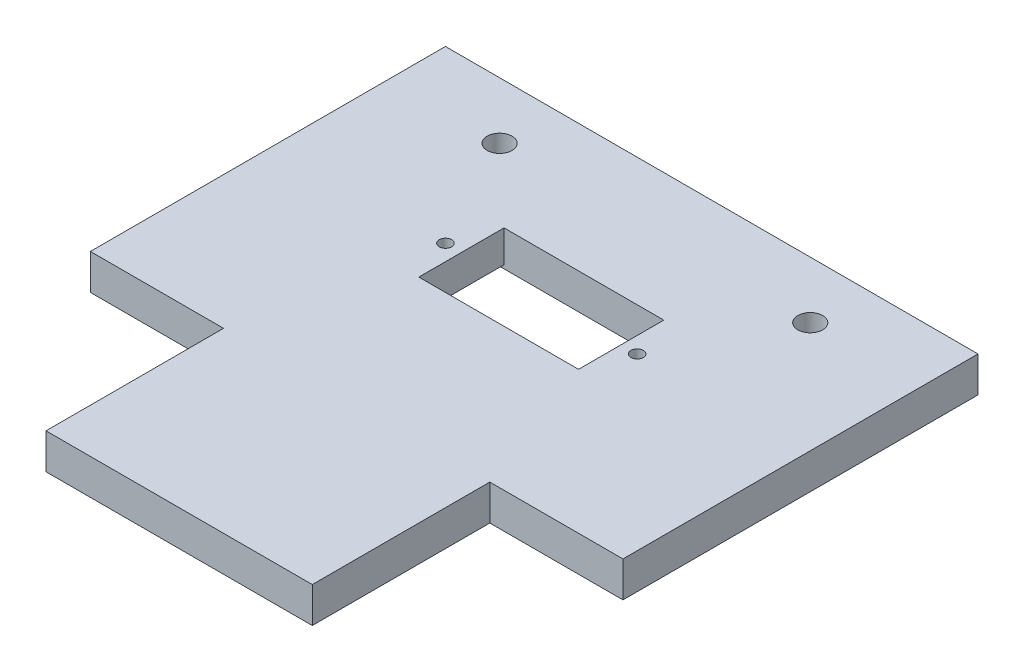
ISO-10303-21;
HEADER;
FILE_DESCRIPTION(('STEP AP214'),'2;1');
FILE_NAME('part.step','',(''),(''),'','','');
FILE_SCHEMA(('AUTOMOTIVE_DESIGN { 1 0 10303 214 1 1 1 1 }'));
ENDSEC;
DATA;
#1=APPLICATION_CONTEXT('core data for automotive mechanical design processes');
#2=APPLICATION_PROTOCOL_DEFINITION('international standard','automotive_design',2000,#1);
#3=PRODUCT_CONTEXT('',#1,'mechanical');
#4=PRODUCT('Part','Part','',(#3));
#5=PRODUCT_RELATED_PRODUCT_CATEGORY('part','',(#4));
#6=PRODUCT_DEFINITION_FORMATION('','',#4);
#7=PRODUCT_DEFINITION_CONTEXT('part definition',#1,'design');
#8=PRODUCT_DEFINITION('design','',#6,#7);
#9=PRODUCT_DEFINITION_SHAPE('','',#8);
#10=(LENGTH_UNIT() NAMED_UNIT(*) SI_UNIT(.MILLI.,.METRE.));
#11=(NAMED_UNIT(*) PLANE_ANGLE_UNIT() SI_UNIT($,.RADIAN.));
#12=(NAMED_UNIT(*) SI_UNIT($,.STERADIAN.) SOLID_ANGLE_UNIT());
#13=UNCERTAINTY_MEASURE_WITH_UNIT(LENGTH_MEASURE(1.E-05),#10,'distance_accuracy_value','');
#14=(GEOMETRIC_REPRESENTATION_CONTEXT(3) GLOBAL_UNCERTAINTY_ASSIGNED_CONTEXT((#13)) GLOBAL_UNIT_ASSIGNED_CONTEXT((#10,
#11,#12)) REPRESENTATION_CONTEXT('',''));
#15=CARTESIAN_POINT('',(0.,0.,0.));
#16=DIRECTION('',(0.,0.,1.));
#17=DIRECTION('',(1.,0.,0.));
#18=AXIS2_PLACEMENT_3D('',#15,#16,#17);
#19=CARTESIAN_POINT('',(38.1,5.08,-38.1));
#20=DIRECTION('',(-1.,0.,0.));
#21=DIRECTION('',(0.,0.,1.));
#22=AXIS2_PLACEMENT_3D('',#19,#20,#21);
#23=PLANE('',#22);
#24=DIRECTION('',(0.,0.,-1.));
#25=VECTOR('',#24,1.);
#26=CARTESIAN_POINT('',(38.1,0.,-38.1));
#27=LINE('',#26,#25);
#28=CARTESIAN_POINT('',(38.1,0.,12.7));
#29=VERTEX_POINT('',#28);
#30=CARTESIAN_POINT('',(38.1,0.,-38.1));
#31=VERTEX_POINT('',#30);
#32=EDGE_CURVE('E268',#29,#31,#27,.T.);
#33=ORIENTED_EDGE('',*,*,#32,.T.);
#34=DIRECTION('',(0.,-1.,0.));
#35=VECTOR('',#34,1.);
#36=CARTESIAN_POINT('',(38.1,5.08,-38.1));
#37=LINE('',#36,#35);
#38=CARTESIAN_POINT('',(38.1,5.08,-38.1));
#39=VERTEX_POINT('',#38);
#40=EDGE_CURVE('E11',#39,#31,#37,.T.);
#41=ORIENTED_EDGE('',*,*,#40,.F.);
#42=DIRECTION('',(0.,0.,-1.));
#43=VECTOR('',#42,1.);
#44=CARTESIAN_POINT('',(38.1,5.08,-38.1));
#45=LINE('',#44,#43);
#46=CARTESIAN_POINT('',(38.1,5.08,12.7));
#47=VERTEX_POINT('',#46);
#48=EDGE_CURVE('E271',#47,#39,#45,.T.);
#49=ORIENTED_EDGE('',*,*,#48,.F.);
#50=DIRECTION('',(0.,-1.,0.));
#51=VECTOR('',#50,1.);
#52=CARTESIAN_POINT('',(38.1,5.08,12.7));
#53=LINE('',#52,#51);
#54=EDGE_CURVE('E289',#47,#29,#53,.T.);
#55=ORIENTED_EDGE('',*,*,#54,.T.);
#56=EDGE_LOOP('',(#33,#41,#49,#55));
#57=FACE_BOUND('',#56,.T.);
#58=ADVANCED_FACE('F35',(#57),#23,.F.);
#59=CARTESIAN_POINT('',(-38.1,5.08,-38.1));
#60=DIRECTION('',(0.,0.,1.));
#61=DIRECTION('',(1.,0.,0.));
#62=AXIS2_PLACEMENT_3D('',#59,#60,#61);
#63=PLANE('',#62);
#64=DIRECTION('',(-1.,0.,0.));
#65=VECTOR('',#64,1.);
#66=CARTESIAN_POINT('',(-38.1,0.,-38.1));
#67=LINE('',#66,#65);
#68=CARTESIAN_POINT('',(-38.1,0.,-38.1));
#69=VERTEX_POINT('',#68);
#70=EDGE_CURVE('E292',#31,#69,#67,.T.);
#71=ORIENTED_EDGE('',*,*,#70,.T.);
#72=DIRECTION('',(0.,-1.,0.));
#73=VECTOR('',#72,1.);
#74=CARTESIAN_POINT('',(-38.1,5.08,-38.1));
#75=LINE('',#74,#73);
#76=CARTESIAN_POINT('',(-38.1,5.08,-38.1));
#77=VERTEX_POINT('',#76);
#78=EDGE_CURVE('E43',#77,#69,#75,.T.);
#79=ORIENTED_EDGE('',*,*,#78,.F.);
#80=DIRECTION('',(-1.,0.,0.));
#81=VECTOR('',#80,1.);
#82=CARTESIAN_POINT('',(-38.1,5.08,-38.1));
#83=LINE('',#82,#81);
#84=EDGE_CURVE('E274',#39,#77,#83,.T.);
#85=ORIENTED_EDGE('',*,*,#84,.F.);
#86=ORIENTED_EDGE('',*,*,#40,.T.);
#87=EDGE_LOOP('',(#71,#79,#85,#86));
#88=FACE_BOUND('',#87,.T.);
#89=ADVANCED_FACE('F349',(#88),#63,.F.);
#90=CARTESIAN_POINT('',(-38.1,5.08,12.7));
#91=DIRECTION('',(1.,0.,0.));
#92=DIRECTION('',(0.,0.,-1.));
#93=AXIS2_PLACEMENT_3D('',#90,#91,#92);
#94=PLANE('',#93);
#95=DIRECTION('',(0.,0.,1.));
#96=VECTOR('',#95,1.);
#97=CARTESIAN_POINT('',(-38.1,0.,12.7));
#98=LINE('',#97,#96);
#99=CARTESIAN_POINT('',(-38.1,0.,12.7));
#100=VERTEX_POINT('',#99);
#101=EDGE_CURVE('E294',#69,#100,#98,.T.);
#102=ORIENTED_EDGE('',*,*,#101,.T.);
#103=DIRECTION('',(0.,-1.,0.));
#104=VECTOR('',#103,1.);
#105=CARTESIAN_POINT('',(-38.1,5.08,12.7));
#106=LINE('',#105,#104);
#107=CARTESIAN_POINT('',(-38.1,5.08,12.7));
#108=VERTEX_POINT('',#107);
#109=EDGE_CURVE('E319',#108,#100,#106,.T.);
#110=ORIENTED_EDGE('',*,*,#109,.F.);
#111=DIRECTION('',(0.,0.,1.));
#112=VECTOR('',#111,1.);
#113=CARTESIAN_POINT('',(-38.1,5.08,12.7));
#114=LINE('',#113,#112);
#115=EDGE_CURVE('E277',#77,#108,#114,.T.);
#116=ORIENTED_EDGE('',*,*,#115,.F.);
#117=ORIENTED_EDGE('',*,*,#78,.T.);
#118=EDGE_LOOP('',(#102,#110,#116,#117));
#119=FACE_BOUND('',#118,.T.);
#120=ADVANCED_FACE('F327',(#119),#94,.F.);
#121=CARTESIAN_POINT('',(-38.1,5.08,12.7));
#122=DIRECTION('',(0.,0.,-1.));
#123=DIRECTION('',(-1.,0.,0.));
#124=AXIS2_PLACEMENT_3D('',#121,#122,#123);
#125=PLANE('',#124);
#126=DIRECTION('',(1.,0.,0.));
#127=VECTOR('',#126,1.);
#128=CARTESIAN_POINT('',(-38.1,0.,12.7));
#129=LINE('',#128,#127);
#130=CARTESIAN_POINT('',(-19.05,0.,12.7));
#131=VERTEX_POINT('',#130);
#132=EDGE_CURVE('E296',#100,#131,#129,.T.);
#133=ORIENTED_EDGE('',*,*,#132,.T.);
#134=DIRECTION('',(0.,-1.,0.));
#135=VECTOR('',#134,1.);
#136=CARTESIAN_POINT('',(-19.05,5.08,12.7));
#137=LINE('',#136,#135);
#138=CARTESIAN_POINT('',(-19.05,5.08,12.7));
#139=VERTEX_POINT('',#138);
#140=EDGE_CURVE('E316',#139,#131,#137,.T.);
#141=ORIENTED_EDGE('',*,*,#140,.F.);
#142=DIRECTION('',(1.,0.,0.));
#143=VECTOR('',#142,1.);
#144=CARTESIAN_POINT('',(-38.1,5.08,12.7));
#145=LINE('',#144,#143);
#146=EDGE_CURVE('E279',#108,#139,#145,.T.);
#147=ORIENTED_EDGE('',*,*,#146,.F.);
#148=ORIENTED_EDGE('',*,*,#109,.T.);
#149=EDGE_LOOP('',(#133,#141,#147,#148));
#150=FACE_BOUND('',#149,.T.);
#151=ADVANCED_FACE('F337',(#150),#125,.F.);
#152=CARTESIAN_POINT('',(-19.05,5.08,38.1));
#153=DIRECTION('',(1.,0.,0.));
#154=DIRECTION('',(0.,0.,-1.));
#155=AXIS2_PLACEMENT_3D('',#152,#153,#154);
#156=PLANE('',#155);
#157=DIRECTION('',(0.,0.,1.));
#158=VECTOR('',#157,1.);
#159=CARTESIAN_POINT('',(-19.05,0.,38.1));
#160=LINE('',#159,#158);
#161=CARTESIAN_POINT('',(-19.05,0.,38.1));
#162=VERTEX_POINT('',#161);
#163=EDGE_CURVE('E298',#131,#162,#160,.T.);
#164=ORIENTED_EDGE('',*,*,#163,.T.);
#165=DIRECTION('',(0.,-1.,0.));
#166=VECTOR('',#165,1.);
#167=CARTESIAN_POINT('',(-19.05,5.08,38.1));
#168=LINE('',#167,#166);
#169=CARTESIAN_POINT('',(-19.05,5.08,38.1));
#170=VERTEX_POINT('',#169);
#171=EDGE_CURVE('E313',#170,#162,#168,.T.);
#172=ORIENTED_EDGE('',*,*,#171,.F.);
#173=DIRECTION('',(0.,0.,1.));
#174=VECTOR('',#173,1.);
#175=CARTESIAN_POINT('',(-19.05,5.08,38.1));
#176=LINE('',#175,#174);
#177=EDGE_CURVE('E281',#139,#170,#176,.T.);
#178=ORIENTED_EDGE('',*,*,#177,.F.);
#179=ORIENTED_EDGE('',*,*,#140,.T.);
#180=EDGE_LOOP('',(#164,#172,#178,#179));
#181=FACE_BOUND('',#180,.T.);
#182=ADVANCED_FACE('F341',(#181),#156,.F.);
#183=CARTESIAN_POINT('',(-19.05,5.08,38.1));
#184=DIRECTION('',(0.,0.,-1.));
#185=DIRECTION('',(-1.,0.,0.));
#186=AXIS2_PLACEMENT_3D('',#183,#184,#185);
#187=PLANE('',#186);
#188=DIRECTION('',(1.,0.,0.));
#189=VECTOR('',#188,1.);
#190=CARTESIAN_POINT('',(-19.05,0.,38.1));
#191=LINE('',#190,#189);
#192=CARTESIAN_POINT('',(19.05,0.,38.1));
#193=VERTEX_POINT('',#192);
#194=EDGE_CURVE('E300',#162,#193,#191,.T.);
#195=ORIENTED_EDGE('',*,*,#194,.T.);
#196=DIRECTION('',(0.,-1.,0.));
#197=VECTOR('',#196,1.);
#198=CARTESIAN_POINT('',(19.05,5.08,38.1));
#199=LINE('',#198,#197);
#200=CARTESIAN_POINT('',(19.05,5.08,38.1));
#201=VERTEX_POINT('',#200);
#202=EDGE_CURVE('E310',#201,#193,#199,.T.);
#203=ORIENTED_EDGE('',*,*,#202,.F.);
#204=DIRECTION('',(1.,0.,0.));
#205=VECTOR('',#204,1.);
#206=CARTESIAN_POINT('',(-19.05,5.08,38.1));
#207=LINE('',#206,#205);
#208=EDGE_CURVE('E283',#170,#201,#207,.T.);
#209=ORIENTED_EDGE('',*,*,#208,.F.);
#210=ORIENTED_EDGE('',*,*,#171,.T.);
#211=EDGE_LOOP('',(#195,#203,#209,#210));
#212=FACE_BOUND('',#211,.T.);
#213=ADVANCED_FACE('F362',(#212),#187,.F.);
#214=CARTESIAN_POINT('',(19.05,5.08,38.1));
#215=DIRECTION('',(-1.,0.,0.));
#216=DIRECTION('',(0.,0.,1.));
#217=AXIS2_PLACEMENT_3D('',#214,#215,#216);
#218=PLANE('',#217);
#219=DIRECTION('',(0.,0.,-1.));
#220=VECTOR('',#219,1.);
#221=CARTESIAN_POINT('',(19.05,0.,38.1));
#222=LINE('',#221,#220);
#223=CARTESIAN_POINT('',(19.05,0.,12.7));
#224=VERTEX_POINT('',#223);
#225=EDGE_CURVE('E302',#193,#224,#222,.T.);
#226=ORIENTED_EDGE('',*,*,#225,.T.);
#227=DIRECTION('',(0.,-1.,0.));
#228=VECTOR('',#227,1.);
#229=CARTESIAN_POINT('',(19.05,5.08,12.7));
#230=LINE('',#229,#228);
#231=CARTESIAN_POINT('',(19.05,5.08,12.7));
#232=VERTEX_POINT('',#231);
#233=EDGE_CURVE('E307',#232,#224,#230,.T.);
#234=ORIENTED_EDGE('',*,*,#233,.F.);
#235=DIRECTION('',(0.,0.,-1.));
#236=VECTOR('',#235,1.);
#237=CARTESIAN_POINT('',(19.05,5.08,38.1));
#238=LINE('',#237,#236);
#239=EDGE_CURVE('E285',#201,#232,#238,.T.);
#240=ORIENTED_EDGE('',*,*,#239,.F.);
#241=ORIENTED_EDGE('',*,*,#202,.T.);
#242=EDGE_LOOP('',(#226,#234,#240,#241));
#243=FACE_BOUND('',#242,.T.);
#244=ADVANCED_FACE('F360',(#243),#218,.F.);
#245=CARTESIAN_POINT('',(38.1,5.08,12.7));
#246=DIRECTION('',(0.,0.,-1.));
#247=DIRECTION('',(-1.,0.,0.));
#248=AXIS2_PLACEMENT_3D('',#245,#246,#247);
#249=PLANE('',#248);
#250=DIRECTION('',(1.,0.,0.));
#251=VECTOR('',#250,1.);
#252=CARTESIAN_POINT('',(38.1,0.,12.7));
#253=LINE('',#252,#251);
#254=EDGE_CURVE('E275',#224,#29,#253,.T.);
#255=ORIENTED_EDGE('',*,*,#254,.T.);
#256=ORIENTED_EDGE('',*,*,#54,.F.);
#257=DIRECTION('',(1.,0.,0.));
#258=VECTOR('',#257,1.);
#259=CARTESIAN_POINT('',(38.1,5.08,12.7));
#260=LINE('',#259,#258);
#261=EDGE_CURVE('E287',#232,#47,#260,.T.);
#262=ORIENTED_EDGE('',*,*,#261,.F.);
#263=ORIENTED_EDGE('',*,*,#233,.T.);
#264=EDGE_LOOP('',(#255,#256,#262,#263));
#265=FACE_BOUND('',#264,.T.);
#266=ADVANCED_FACE('F355',(#265),#249,.F.);
#267=CARTESIAN_POINT('',(0.,5.08,0.));
#268=DIRECTION('',(0.,-1.,0.));
#269=DIRECTION('',(0.,0.,-1.));
#270=AXIS2_PLACEMENT_3D('',#267,#268,#269);
#271=PLANE('',#270);
#272=CARTESIAN_POINT('',(13.716,5.08,-13.716));
#273=DIRECTION('',(0.,-1.,0.));
#274=DIRECTION('',(0.,0.,-1.));
#275=AXIS2_PLACEMENT_3D('',#272,#273,#274);
#276=CIRCLE('',#275,0.889);
#277=CARTESIAN_POINT('',(13.716,5.08,-14.605));
#278=VERTEX_POINT('',#277);
#279=EDGE_CURVE('E209',#278,#278,#276,.T.);
#280=ORIENTED_EDGE('',*,*,#279,.T.);
#281=EDGE_LOOP('',(#280));
#282=FACE_BOUND('',#281,.T.);
#283=CARTESIAN_POINT('',(-13.716,5.08,-13.716));
#284=DIRECTION('',(0.,-1.,0.));
#285=DIRECTION('',(0.,0.,-1.));
#286=AXIS2_PLACEMENT_3D('',#283,#284,#285);
#287=CIRCLE('',#286,0.889);
#288=CARTESIAN_POINT('',(-13.716,5.08,-14.605));
#289=VERTEX_POINT('',#288);
#290=EDGE_CURVE('E203',#289,#289,#287,.T.);
#291=ORIENTED_EDGE('',*,*,#290,.T.);
#292=EDGE_LOOP('',(#291));
#293=FACE_BOUND('',#292,.T.);
#294=DIRECTION('',(-1.,0.,0.));
#295=VECTOR('',#294,1.);
#296=CARTESIAN_POINT('',(-11.43,5.08,-19.812));
#297=LINE('',#296,#295);
#298=CARTESIAN_POINT('',(11.43,5.08,-19.812));
#299=VERTEX_POINT('',#298);
#300=CARTESIAN_POINT('',(-11.43,5.08,-19.812));
#301=VERTEX_POINT('',#300);
#302=EDGE_CURVE('E549',#299,#301,#297,.T.);
#303=ORIENTED_EDGE('',*,*,#302,.F.);
#304=DIRECTION('',(0.,0.,-1.));
#305=VECTOR('',#304,1.);
#306=CARTESIAN_POINT('',(11.43,5.08,-7.62));
#307=LINE('',#306,#305);
#308=CARTESIAN_POINT('',(11.43,5.08,-7.62));
#309=VERTEX_POINT('',#308);
#310=EDGE_CURVE('E59',#309,#299,#307,.T.);
#311=ORIENTED_EDGE('',*,*,#310,.F.);
#312=DIRECTION('',(1.,0.,0.));
#313=VECTOR('',#312,1.);
#314=CARTESIAN_POINT('',(-11.43,5.08,-7.62));
#315=LINE('',#314,#313);
#316=CARTESIAN_POINT('',(-11.43,5.08,-7.62));
#317=VERTEX_POINT('',#316);
#318=EDGE_CURVE('E230',#317,#309,#315,.T.);
#319=ORIENTED_EDGE('',*,*,#318,.F.);
#320=DIRECTION('',(0.,0.,1.));
#321=VECTOR('',#320,1.);
#322=CARTESIAN_POINT('',(-11.43,5.08,-7.62));
#323=LINE('',#322,#321);
#324=EDGE_CURVE('E546',#301,#317,#323,.T.);
#325=ORIENTED_EDGE('',*,*,#324,.F.);
#326=EDGE_LOOP('',(#303,#311,#319,#325));
#327=FACE_BOUND('',#326,.T.);
#328=CARTESIAN_POINT('',(22.225,5.08,-29.972));
#329=DIRECTION('',(0.,1.,0.));
#330=DIRECTION('',(0.,0.,-1.));
#331=AXIS2_PLACEMENT_3D('',#328,#329,#330);
#332=CIRCLE('',#331,1.778);
#333=CARTESIAN_POINT('',(22.225,5.08,-31.75));
#334=VERTEX_POINT('',#333);
#335=EDGE_CURVE('E253',#334,#334,#332,.T.);
#336=ORIENTED_EDGE('',*,*,#335,.F.);
#337=EDGE_LOOP('',(#336));
#338=FACE_BOUND('',#337,.T.);
#339=CARTESIAN_POINT('',(-22.225,5.08,-29.972));
#340=DIRECTION('',(0.,1.,0.));
#341=DIRECTION('',(0.,0.,1.));
#342=AXIS2_PLACEMENT_3D('',#339,#340,#341);
#343=CIRCLE('',#342,1.778);
#344=CARTESIAN_POINT('',(-22.225,5.08,-28.194));
#345=VERTEX_POINT('',#344);
#346=EDGE_CURVE('E261',#345,#345,#343,.T.);
#347=ORIENTED_EDGE('',*,*,#346,.F.);
#348=EDGE_LOOP('',(#347));
#349=FACE_BOUND('',#348,.T.);
#350=ORIENTED_EDGE('',*,*,#48,.T.);
#351=ORIENTED_EDGE('',*,*,#84,.T.);
#352=ORIENTED_EDGE('',*,*,#115,.T.);
#353=ORIENTED_EDGE('',*,*,#146,.T.);
#354=ORIENTED_EDGE('',*,*,#177,.T.);
#355=ORIENTED_EDGE('',*,*,#208,.T.);
#356=ORIENTED_EDGE('',*,*,#239,.T.);
#357=ORIENTED_EDGE('',*,*,#261,.T.);
#358=EDGE_LOOP('',(#350,#351,#352,#353,#354,#355,#356,#357));
#359=FACE_BOUND('',#358,.T.);
#360=ADVANCED_FACE('F345',(#282,#293,#327,#338,#349,#359),#271,.F.);
#361=CARTESIAN_POINT('',(0.,0.,0.));
#362=DIRECTION('',(0.,-1.,0.));
#363=DIRECTION('',(0.,0.,-1.));
#364=AXIS2_PLACEMENT_3D('',#361,#362,#363);
#365=PLANE('',#364);
#366=DIRECTION('',(0.,0.,-1.));
#367=VECTOR('',#366,1.);
#368=CARTESIAN_POINT('',(-16.51,0.,-7.61999999999998));
#369=LINE('',#368,#367);
#370=CARTESIAN_POINT('',(-16.51,0.,-7.61999999999998));
#371=VERTEX_POINT('',#370);
#372=CARTESIAN_POINT('',(-16.51,0.,-19.812));
#373=VERTEX_POINT('',#372);
#374=EDGE_CURVE('E51',#371,#373,#369,.T.);
#375=ORIENTED_EDGE('',*,*,#374,.F.);
#376=DIRECTION('',(-1.,0.,0.));
#377=VECTOR('',#376,1.);
#378=CARTESIAN_POINT('',(16.51,0.,-7.61999999999998));
#379=LINE('',#378,#377);
#380=CARTESIAN_POINT('',(16.51,0.,-7.61999999999998));
#381=VERTEX_POINT('',#380);
#382=EDGE_CURVE('E175',#381,#371,#379,.T.);
#383=ORIENTED_EDGE('',*,*,#382,.F.);
#384=DIRECTION('',(0.,0.,1.));
#385=VECTOR('',#384,1.);
#386=CARTESIAN_POINT('',(16.51,0.,-7.61999999999998));
#387=LINE('',#386,#385);
#388=CARTESIAN_POINT('',(16.51,0.,-19.812));
#389=VERTEX_POINT('',#388);
#390=EDGE_CURVE('E156',#389,#381,#387,.T.);
#391=ORIENTED_EDGE('',*,*,#390,.F.);
#392=DIRECTION('',(1.,0.,0.));
#393=VECTOR('',#392,1.);
#394=CARTESIAN_POINT('',(16.51,0.,-19.812));
#395=LINE('',#394,#393);
#396=EDGE_CURVE('E167',#373,#389,#395,.T.);
#397=ORIENTED_EDGE('',*,*,#396,.F.);
#398=EDGE_LOOP('',(#375,#383,#391,#397));
#399=FACE_BOUND('',#398,.T.);
#400=CARTESIAN_POINT('',(22.225,0.,-29.972));
#401=DIRECTION('',(0.,1.,0.));
#402=DIRECTION('',(0.,0.,-1.));
#403=AXIS2_PLACEMENT_3D('',#400,#401,#402);
#404=CIRCLE('',#403,1.778);
#405=CARTESIAN_POINT('',(22.225,0.,-31.75));
#406=VERTEX_POINT('',#405);
#407=EDGE_CURVE('E256',#406,#406,#404,.T.);
#408=ORIENTED_EDGE('',*,*,#407,.T.);
#409=EDGE_LOOP('',(#408));
#410=FACE_BOUND('',#409,.T.);
#411=CARTESIAN_POINT('',(-22.225,0.,-29.972));
#412=DIRECTION('',(0.,1.,0.));
#413=DIRECTION('',(0.,0.,1.));
#414=AXIS2_PLACEMENT_3D('',#411,#412,#413);
#415=CIRCLE('',#414,1.778);
#416=CARTESIAN_POINT('',(-22.225,0.,-28.194));
#417=VERTEX_POINT('',#416);
#418=EDGE_CURVE('E265',#417,#417,#415,.T.);
#419=ORIENTED_EDGE('',*,*,#418,.T.);
#420=EDGE_LOOP('',(#419));
#421=FACE_BOUND('',#420,.T.);
#422=ORIENTED_EDGE('',*,*,#32,.F.);
#423=ORIENTED_EDGE('',*,*,#254,.F.);
#424=ORIENTED_EDGE('',*,*,#225,.F.);
#425=ORIENTED_EDGE('',*,*,#194,.F.);
#426=ORIENTED_EDGE('',*,*,#163,.F.);
#427=ORIENTED_EDGE('',*,*,#132,.F.);
#428=ORIENTED_EDGE('',*,*,#101,.F.);
#429=ORIENTED_EDGE('',*,*,#70,.F.);
#430=EDGE_LOOP('',(#422,#423,#424,#425,#426,#427,#428,#429));
#431=FACE_BOUND('',#430,.T.);
#432=ADVANCED_FACE('F172',(#399,#410,#421,#431),#365,.T.);
#433=CARTESIAN_POINT('',(-22.225,0.,-29.972));
#434=DIRECTION('',(0.,1.,0.));
#435=DIRECTION('',(0.,0.,1.));
#436=AXIS2_PLACEMENT_3D('',#433,#434,#435);
#437=CYLINDRICAL_SURFACE('',#436,1.778);
#438=ORIENTED_EDGE('',*,*,#418,.F.);
#439=EDGE_LOOP('',(#438));
#440=FACE_BOUND('',#439,.T.);
#441=ORIENTED_EDGE('',*,*,#346,.T.);
#442=EDGE_LOOP('',(#441));
#443=FACE_BOUND('',#442,.T.);
#444=ADVANCED_FACE('F414',(#440,#443),#437,.F.);
#445=CARTESIAN_POINT('',(22.225,0.,-29.972));
#446=DIRECTION('',(0.,1.,0.));
#447=DIRECTION('',(0.,0.,1.));
#448=AXIS2_PLACEMENT_3D('',#445,#446,#447);
#449=CYLINDRICAL_SURFACE('',#448,1.778);
#450=ORIENTED_EDGE('',*,*,#407,.F.);
#451=EDGE_LOOP('',(#450));
#452=FACE_BOUND('',#451,.T.);
#453=ORIENTED_EDGE('',*,*,#335,.T.);
#454=EDGE_LOOP('',(#453));
#455=FACE_BOUND('',#454,.T.);
#456=ADVANCED_FACE('F419',(#452,#455),#449,.F.);
#457=CARTESIAN_POINT('',(11.43,0.508000000000001,-7.62));
#458=DIRECTION('',(1.,0.,0.));
#459=DIRECTION('',(0.,0.,-1.));
#460=AXIS2_PLACEMENT_3D('',#457,#458,#459);
#461=PLANE('',#460);
#462=ORIENTED_EDGE('',*,*,#310,.T.);
#463=DIRECTION('',(0.,1.,0.));
#464=VECTOR('',#463,1.);
#465=CARTESIAN_POINT('',(11.43,0.508000000000001,-19.812));
#466=LINE('',#465,#464);
#467=CARTESIAN_POINT('',(11.43,0.508000000000002,-19.812));
#468=VERTEX_POINT('',#467);
#469=EDGE_CURVE('E232',#468,#299,#466,.T.);
#470=ORIENTED_EDGE('',*,*,#469,.F.);
#471=DIRECTION('',(0.,0.,-1.));
#472=VECTOR('',#471,1.);
#473=CARTESIAN_POINT('',(11.43,0.508000000000001,-7.62));
#474=LINE('',#473,#472);
#475=CARTESIAN_POINT('',(11.43,0.508000000000002,-7.61999999999998));
#476=VERTEX_POINT('',#475);
#477=EDGE_CURVE('E227',#476,#468,#474,.T.);
#478=ORIENTED_EDGE('',*,*,#477,.F.);
#479=DIRECTION('',(0.,1.,0.));
#480=VECTOR('',#479,1.);
#481=CARTESIAN_POINT('',(11.43,0.508000000000001,-7.62));
#482=LINE('',#481,#480);
#483=EDGE_CURVE('E251',#476,#309,#482,.T.);
#484=ORIENTED_EDGE('',*,*,#483,.T.);
#485=EDGE_LOOP('',(#462,#470,#478,#484));
#486=FACE_BOUND('',#485,.T.);
#487=ADVANCED_FACE('F234',(#486),#461,.F.);
#488=CARTESIAN_POINT('',(-11.43,0.508000000000001,-7.62));
#489=DIRECTION('',(0.,0.,1.));
#490=DIRECTION('',(1.,0.,0.));
#491=AXIS2_PLACEMENT_3D('',#488,#489,#490);
#492=PLANE('',#491);
#493=ORIENTED_EDGE('',*,*,#318,.T.);
#494=ORIENTED_EDGE('',*,*,#483,.F.);
#495=DIRECTION('',(1.,0.,0.));
#496=VECTOR('',#495,1.);
#497=CARTESIAN_POINT('',(16.51,0.508000000000002,-7.61999999999998));
#498=LINE('',#497,#496);
#499=CARTESIAN_POINT('',(16.51,0.508000000000002,-7.61999999999998));
#500=VERTEX_POINT('',#499);
#501=EDGE_CURVE('E196',#476,#500,#498,.T.);
#502=ORIENTED_EDGE('',*,*,#501,.T.);
#503=DIRECTION('',(0.,-1.,0.));
#504=VECTOR('',#503,1.);
#505=CARTESIAN_POINT('',(16.51,35.7069383930823,-7.61999999999998));
#506=LINE('',#505,#504);
#507=EDGE_CURVE('E163',#500,#381,#506,.T.);
#508=ORIENTED_EDGE('',*,*,#507,.T.);
#509=ORIENTED_EDGE('',*,*,#382,.T.);
#510=DIRECTION('',(0.,-1.,0.));
#511=VECTOR('',#510,1.);
#512=CARTESIAN_POINT('',(-16.51,35.7069383930823,-7.61999999999998));
#513=LINE('',#512,#511);
#514=CARTESIAN_POINT('',(-16.51,0.508000000000002,-7.61999999999998));
#515=VERTEX_POINT('',#514);
#516=EDGE_CURVE('E180',#515,#371,#513,.T.);
#517=ORIENTED_EDGE('',*,*,#516,.F.);
#518=CARTESIAN_POINT('',(-11.43,0.508000000000002,-7.61999999999998));
#519=VERTEX_POINT('',#518);
#520=EDGE_CURVE('E192',#515,#519,#498,.T.);
#521=ORIENTED_EDGE('',*,*,#520,.T.);
#522=DIRECTION('',(0.,1.,0.));
#523=VECTOR('',#522,1.);
#524=CARTESIAN_POINT('',(-11.43,0.508000000000001,-7.62));
#525=LINE('',#524,#523);
#526=EDGE_CURVE('E236',#519,#317,#525,.T.);
#527=ORIENTED_EDGE('',*,*,#526,.T.);
#528=EDGE_LOOP('',(#493,#494,#502,#508,#509,#517,#521,#527));
#529=FACE_BOUND('',#528,.T.);
#530=ADVANCED_FACE('F446',(#529),#492,.F.);
#531=CARTESIAN_POINT('',(-11.43,0.508000000000001,-7.62));
#532=DIRECTION('',(-1.,0.,0.));
#533=DIRECTION('',(0.,0.,1.));
#534=AXIS2_PLACEMENT_3D('',#531,#532,#533);
#535=PLANE('',#534);
#536=ORIENTED_EDGE('',*,*,#324,.T.);
#537=ORIENTED_EDGE('',*,*,#526,.F.);
#538=DIRECTION('',(0.,0.,1.));
#539=VECTOR('',#538,1.);
#540=CARTESIAN_POINT('',(-11.43,0.508000000000001,-7.62));
#541=LINE('',#540,#539);
#542=CARTESIAN_POINT('',(-11.43,0.508000000000001,-19.812));
#543=VERTEX_POINT('',#542);
#544=EDGE_CURVE('E229',#543,#519,#541,.T.);
#545=ORIENTED_EDGE('',*,*,#544,.F.);
#546=DIRECTION('',(0.,1.,0.));
#547=VECTOR('',#546,1.);
#548=CARTESIAN_POINT('',(-11.43,0.508000000000001,-19.812));
#549=LINE('',#548,#547);
#550=EDGE_CURVE('E235',#543,#301,#549,.T.);
#551=ORIENTED_EDGE('',*,*,#550,.T.);
#552=EDGE_LOOP('',(#536,#537,#545,#551));
#553=FACE_BOUND('',#552,.T.);
#554=ADVANCED_FACE('F456',(#553),#535,.F.);
#555=CARTESIAN_POINT('',(-11.43,0.508000000000001,-19.812));
#556=DIRECTION('',(0.,0.,-1.));
#557=DIRECTION('',(-1.,0.,0.));
#558=AXIS2_PLACEMENT_3D('',#555,#556,#557);
#559=PLANE('',#558);
#560=ORIENTED_EDGE('',*,*,#302,.T.);
#561=ORIENTED_EDGE('',*,*,#550,.F.);
#562=DIRECTION('',(-1.,0.,0.));
#563=VECTOR('',#562,1.);
#564=CARTESIAN_POINT('',(16.51,0.508000000000002,-19.812));
#565=LINE('',#564,#563);
#566=CARTESIAN_POINT('',(-16.51,0.508000000000002,-19.812));
#567=VERTEX_POINT('',#566);
#568=EDGE_CURVE('E189',#543,#567,#565,.T.);
#569=ORIENTED_EDGE('',*,*,#568,.T.);
#570=DIRECTION('',(0.,-1.,0.));
#571=VECTOR('',#570,1.);
#572=CARTESIAN_POINT('',(-16.51,35.7069383930823,-19.812));
#573=LINE('',#572,#571);
#574=EDGE_CURVE('E164',#567,#373,#573,.T.);
#575=ORIENTED_EDGE('',*,*,#574,.T.);
#576=ORIENTED_EDGE('',*,*,#396,.T.);
#577=DIRECTION('',(0.,-1.,0.));
#578=VECTOR('',#577,1.);
#579=CARTESIAN_POINT('',(16.51,35.7069383930823,-19.812));
#580=LINE('',#579,#578);
#581=CARTESIAN_POINT('',(16.51,0.508000000000002,-19.812));
#582=VERTEX_POINT('',#581);
#583=EDGE_CURVE('E151',#582,#389,#580,.T.);
#584=ORIENTED_EDGE('',*,*,#583,.F.);
#585=EDGE_CURVE('E186',#582,#468,#565,.T.);
#586=ORIENTED_EDGE('',*,*,#585,.T.);
#587=ORIENTED_EDGE('',*,*,#469,.T.);
#588=EDGE_LOOP('',(#560,#561,#569,#575,#576,#584,#586,#587));
#589=FACE_BOUND('',#588,.T.);
#590=ADVANCED_FACE('F169',(#589),#559,.F.);
#591=CARTESIAN_POINT('',(0.,0.508000000000001,0.));
#592=DIRECTION('',(0.,-1.,0.));
#593=DIRECTION('',(0.,0.,-1.));
#594=AXIS2_PLACEMENT_3D('',#591,#592,#593);
#595=PLANE('',#594);
#596=CARTESIAN_POINT('',(13.716,0.508000000000001,-13.716));
#597=DIRECTION('',(0.,-1.,0.));
#598=DIRECTION('',(0.,0.,-1.));
#599=AXIS2_PLACEMENT_3D('',#596,#597,#598);
#600=CIRCLE('',#599,0.889);
#601=CARTESIAN_POINT('',(13.716,0.508000000000001,-14.605));
#602=VERTEX_POINT('',#601);
#603=EDGE_CURVE('E214',#602,#602,#600,.T.);
#604=ORIENTED_EDGE('',*,*,#603,.F.);
#605=EDGE_LOOP('',(#604));
#606=FACE_BOUND('',#605,.T.);
#607=ORIENTED_EDGE('',*,*,#477,.T.);
#608=ORIENTED_EDGE('',*,*,#585,.F.);
#609=DIRECTION('',(0.,0.,-1.));
#610=VECTOR('',#609,1.);
#611=CARTESIAN_POINT('',(16.51,0.508000000000002,-7.61999999999998));
#612=LINE('',#611,#610);
#613=EDGE_CURVE('E159',#500,#582,#612,.T.);
#614=ORIENTED_EDGE('',*,*,#613,.F.);
#615=ORIENTED_EDGE('',*,*,#501,.F.);
#616=EDGE_LOOP('',(#607,#608,#614,#615));
#617=FACE_BOUND('',#616,.T.);
#618=ADVANCED_FACE('F221',(#606,#617),#595,.T.);
#619=CARTESIAN_POINT('',(-13.716,0.508000000000001,-13.716));
#620=DIRECTION('',(0.,-1.,0.));
#621=DIRECTION('',(0.,0.,-1.));
#622=AXIS2_PLACEMENT_3D('',#619,#620,#621);
#623=CIRCLE('',#622,0.889);
#624=CARTESIAN_POINT('',(-13.716,0.508000000000001,-14.605));
#625=VERTEX_POINT('',#624);
#626=EDGE_CURVE('E205',#625,#625,#623,.T.);
#627=ORIENTED_EDGE('',*,*,#626,.F.);
#628=EDGE_LOOP('',(#627));
#629=FACE_BOUND('',#628,.T.);
#630=ORIENTED_EDGE('',*,*,#544,.T.);
#631=ORIENTED_EDGE('',*,*,#520,.F.);
#632=DIRECTION('',(0.,0.,1.));
#633=VECTOR('',#632,1.);
#634=CARTESIAN_POINT('',(-16.51,0.508000000000002,-7.61999999999998));
#635=LINE('',#634,#633);
#636=EDGE_CURVE('E191',#567,#515,#635,.T.);
#637=ORIENTED_EDGE('',*,*,#636,.F.);
#638=ORIENTED_EDGE('',*,*,#568,.F.);
#639=EDGE_LOOP('',(#630,#631,#637,#638));
#640=FACE_BOUND('',#639,.T.);
#641=ADVANCED_FACE('F224',(#629,#640),#595,.T.);
#642=CARTESIAN_POINT('',(-16.51,35.7069383930823,-7.61999999999998));
#643=DIRECTION('',(-1.,0.,0.));
#644=DIRECTION('',(0.,0.,1.));
#645=AXIS2_PLACEMENT_3D('',#642,#643,#644);
#646=PLANE('',#645);
#647=ORIENTED_EDGE('',*,*,#636,.T.);
#648=ORIENTED_EDGE('',*,*,#516,.T.);
#649=ORIENTED_EDGE('',*,*,#374,.T.);
#650=ORIENTED_EDGE('',*,*,#574,.F.);
#651=EDGE_LOOP('',(#647,#648,#649,#650));
#652=FACE_BOUND('',#651,.T.);
#653=ADVANCED_FACE('F481',(#652),#646,.F.);
#654=CARTESIAN_POINT('',(16.51,35.7069383930823,-7.61999999999998));
#655=DIRECTION('',(1.,0.,0.));
#656=DIRECTION('',(0.,0.,-1.));
#657=AXIS2_PLACEMENT_3D('',#654,#655,#656);
#658=PLANE('',#657);
#659=ORIENTED_EDGE('',*,*,#613,.T.);
#660=ORIENTED_EDGE('',*,*,#583,.T.);
#661=ORIENTED_EDGE('',*,*,#390,.T.);
#662=ORIENTED_EDGE('',*,*,#507,.F.);
#663=EDGE_LOOP('',(#659,#660,#661,#662));
#664=FACE_BOUND('',#663,.T.);
#665=ADVANCED_FACE('F153',(#664),#658,.F.);
#666=CARTESIAN_POINT('',(-13.716,5.080025,-13.716));
#667=DIRECTION('',(0.,-1.,0.));
#668=DIRECTION('',(0.,0.,-1.));
#669=AXIS2_PLACEMENT_3D('',#666,#667,#668);
#670=CYLINDRICAL_SURFACE('',#669,0.889);
#671=ORIENTED_EDGE('',*,*,#626,.T.);
#672=EDGE_LOOP('',(#671));
#673=FACE_BOUND('',#672,.T.);
#674=ORIENTED_EDGE('',*,*,#290,.F.);
#675=EDGE_LOOP('',(#674));
#676=FACE_BOUND('',#675,.T.);
#677=ADVANCED_FACE('F496',(#673,#676),#670,.F.);
#678=CARTESIAN_POINT('',(13.716,5.080025,-13.716));
#679=DIRECTION('',(0.,-1.,0.));
#680=DIRECTION('',(0.,0.,-1.));
#681=AXIS2_PLACEMENT_3D('',#678,#679,#680);
#682=CYLINDRICAL_SURFACE('',#681,0.889);
#683=ORIENTED_EDGE('',*,*,#603,.T.);
#684=EDGE_LOOP('',(#683));
#685=FACE_BOUND('',#684,.T.);
#686=ORIENTED_EDGE('',*,*,#279,.F.);
#687=EDGE_LOOP('',(#686));
#688=FACE_BOUND('',#687,.T.);
#689=ADVANCED_FACE('F218',(#685,#688),#682,.F.);
#690=CLOSED_SHELL('',(#58,#89,#120,#151,#182,#213,#244,#266,#360,#432,#444,#456,#487,#530,#554,
#590,#618,#641,#653,#665,#677,#689));
#691=MANIFOLD_SOLID_BREP('B2',#690);
#692=ADVANCED_BREP_SHAPE_REPRESENTATION('',(#18,#691),#14);
#693=SHAPE_DEFINITION_REPRESENTATION(#9,#692);
ENDSEC;
END-ISO-10303-21;
